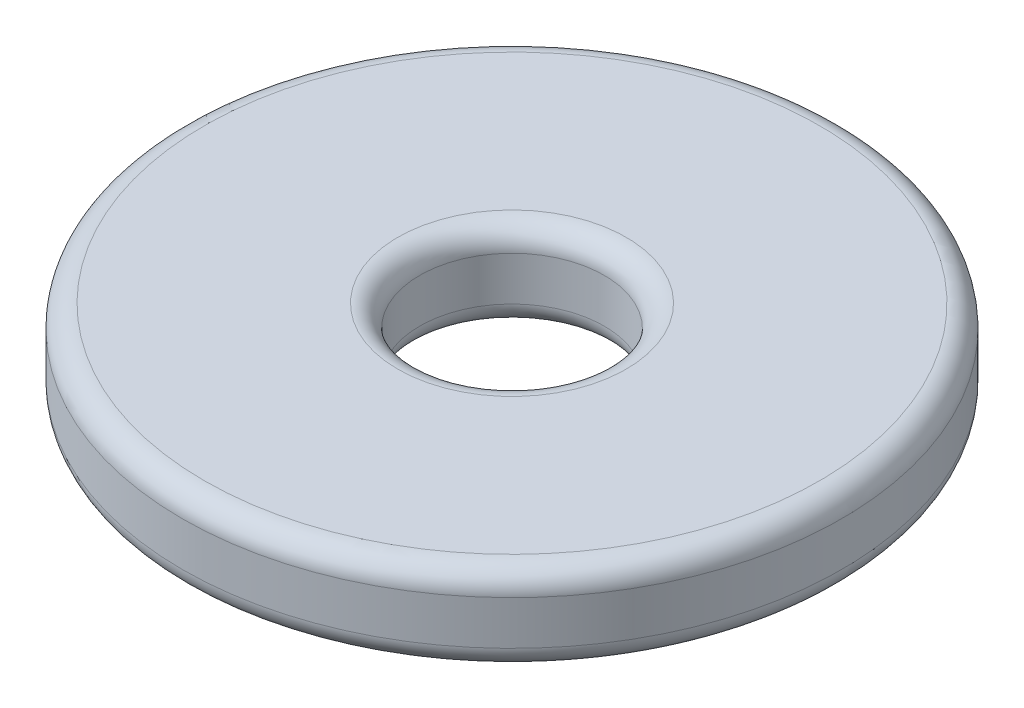
ISO-10303-21;
HEADER;
FILE_DESCRIPTION(('STEP AP214'),'2;1');
FILE_NAME('part.step','',(''),(''),'','','');
FILE_SCHEMA(('AUTOMOTIVE_DESIGN { 1 0 10303 214 1 1 1 1 }'));
ENDSEC;
DATA;
#1=APPLICATION_CONTEXT('core data for automotive mechanical design processes');
#2=APPLICATION_PROTOCOL_DEFINITION('international standard','automotive_design',2000,#1);
#3=PRODUCT_CONTEXT('',#1,'mechanical');
#4=PRODUCT('Part','Part','',(#3));
#5=PRODUCT_RELATED_PRODUCT_CATEGORY('part','',(#4));
#6=PRODUCT_DEFINITION_FORMATION('','',#4);
#7=PRODUCT_DEFINITION_CONTEXT('part definition',#1,'design');
#8=PRODUCT_DEFINITION('design','',#6,#7);
#9=PRODUCT_DEFINITION_SHAPE('','',#8);
#10=(LENGTH_UNIT() NAMED_UNIT(*) SI_UNIT(.MILLI.,.METRE.));
#11=(NAMED_UNIT(*) PLANE_ANGLE_UNIT() SI_UNIT($,.RADIAN.));
#12=(NAMED_UNIT(*) SI_UNIT($,.STERADIAN.) SOLID_ANGLE_UNIT());
#13=UNCERTAINTY_MEASURE_WITH_UNIT(LENGTH_MEASURE(1.E-05),#10,'distance_accuracy_value','');
#14=(GEOMETRIC_REPRESENTATION_CONTEXT(3) GLOBAL_UNCERTAINTY_ASSIGNED_CONTEXT((#13)) GLOBAL_UNIT_ASSIGNED_CONTEXT((#10,
#11,#12)) REPRESENTATION_CONTEXT('',''));
#15=CARTESIAN_POINT('',(0.,0.,0.));
#16=DIRECTION('',(0.,0.,1.));
#17=DIRECTION('',(1.,0.,0.));
#18=AXIS2_PLACEMENT_3D('',#15,#16,#17);
#19=CARTESIAN_POINT('',(0.,2.,0.));
#20=DIRECTION('',(0.,1.,0.));
#21=DIRECTION('',(0.,0.,1.));
#22=AXIS2_PLACEMENT_3D('',#19,#20,#21);
#23=PLANE('',#22);
#24=CARTESIAN_POINT('',(0.,2.,0.));
#25=DIRECTION('',(0.,1.,0.));
#26=DIRECTION('',(0.,0.,1.));
#27=AXIS2_PLACEMENT_3D('',#24,#25,#26);
#28=CIRCLE('',#27,2.6);
#29=CARTESIAN_POINT('',(0.,2.,2.6));
#30=VERTEX_POINT('',#29);
#31=EDGE_CURVE('E42',#30,#30,#28,.F.);
#32=ORIENTED_EDGE('',*,*,#31,.T.);
#33=EDGE_LOOP('',(#32));
#34=FACE_BOUND('',#33,.T.);
#35=CARTESIAN_POINT('',(0.,2.,0.));
#36=DIRECTION('',(0.,1.,0.));
#37=DIRECTION('',(0.,0.,1.));
#38=AXIS2_PLACEMENT_3D('',#35,#36,#37);
#39=CIRCLE('',#38,7.);
#40=CARTESIAN_POINT('',(0.,2.,7.));
#41=VERTEX_POINT('',#40);
#42=EDGE_CURVE('E46',#41,#41,#39,.T.);
#43=ORIENTED_EDGE('',*,*,#42,.T.);
#44=EDGE_LOOP('',(#43));
#45=FACE_BOUND('',#44,.T.);
#46=ADVANCED_FACE('F31',(#34,#45),#23,.T.);
#47=CARTESIAN_POINT('',(0.,0.,0.));
#48=DIRECTION('',(0.,1.,0.));
#49=DIRECTION('',(0.,0.,1.));
#50=AXIS2_PLACEMENT_3D('',#47,#48,#49);
#51=PLANE('',#50);
#52=CARTESIAN_POINT('',(0.,0.,0.));
#53=DIRECTION('',(0.,1.,0.));
#54=DIRECTION('',(0.,0.,1.));
#55=AXIS2_PLACEMENT_3D('',#52,#53,#54);
#56=CIRCLE('',#55,2.6);
#57=CARTESIAN_POINT('',(0.,0.,2.6));
#58=VERTEX_POINT('',#57);
#59=EDGE_CURVE('E57',#58,#58,#56,.T.);
#60=ORIENTED_EDGE('',*,*,#59,.T.);
#61=EDGE_LOOP('',(#60));
#62=FACE_BOUND('',#61,.T.);
#63=CARTESIAN_POINT('',(0.,0.,0.));
#64=DIRECTION('',(0.,1.,0.));
#65=DIRECTION('',(0.,0.,1.));
#66=AXIS2_PLACEMENT_3D('',#63,#64,#65);
#67=CIRCLE('',#66,7.);
#68=CARTESIAN_POINT('',(0.,0.,7.));
#69=VERTEX_POINT('',#68);
#70=EDGE_CURVE('E60',#69,#69,#67,.F.);
#71=ORIENTED_EDGE('',*,*,#70,.T.);
#72=EDGE_LOOP('',(#71));
#73=FACE_BOUND('',#72,.T.);
#74=ADVANCED_FACE('F64',(#62,#73),#51,.F.);
#75=CARTESIAN_POINT('',(0.,2.,0.));
#76=DIRECTION('',(0.,-1.,0.));
#77=DIRECTION('',(0.,0.,-1.));
#78=AXIS2_PLACEMENT_3D('',#75,#76,#77);
#79=CYLINDRICAL_SURFACE('',#78,7.5);
#80=CARTESIAN_POINT('',(0.,0.5,0.));
#81=DIRECTION('',(0.,1.,0.));
#82=DIRECTION('',(0.,0.,1.));
#83=AXIS2_PLACEMENT_3D('',#80,#81,#82);
#84=CIRCLE('',#83,7.5);
#85=CARTESIAN_POINT('',(0.,0.5,7.5));
#86=VERTEX_POINT('',#85);
#87=EDGE_CURVE('E10',#86,#86,#84,.T.);
#88=ORIENTED_EDGE('',*,*,#87,.T.);
#89=EDGE_LOOP('',(#88));
#90=FACE_BOUND('',#89,.T.);
#91=CARTESIAN_POINT('',(0.,1.5,0.));
#92=DIRECTION('',(0.,1.,0.));
#93=DIRECTION('',(0.,0.,1.));
#94=AXIS2_PLACEMENT_3D('',#91,#92,#93);
#95=CIRCLE('',#94,7.5);
#96=CARTESIAN_POINT('',(0.,1.5,7.5));
#97=VERTEX_POINT('',#96);
#98=EDGE_CURVE('E38',#97,#97,#95,.F.);
#99=ORIENTED_EDGE('',*,*,#98,.T.);
#100=EDGE_LOOP('',(#99));
#101=FACE_BOUND('',#100,.T.);
#102=ADVANCED_FACE('F84',(#90,#101),#79,.T.);
#103=CARTESIAN_POINT('',(0.,2.,0.));
#104=DIRECTION('',(0.,-1.,0.));
#105=DIRECTION('',(0.,0.,-1.));
#106=AXIS2_PLACEMENT_3D('',#103,#104,#105);
#107=CYLINDRICAL_SURFACE('',#106,2.1);
#108=CARTESIAN_POINT('',(0.,0.5,0.));
#109=DIRECTION('',(0.,1.,0.));
#110=DIRECTION('',(0.,0.,1.));
#111=AXIS2_PLACEMENT_3D('',#108,#109,#110);
#112=CIRCLE('',#111,2.1);
#113=CARTESIAN_POINT('',(0.,0.5,2.1));
#114=VERTEX_POINT('',#113);
#115=EDGE_CURVE('E51',#114,#114,#112,.F.);
#116=ORIENTED_EDGE('',*,*,#115,.T.);
#117=EDGE_LOOP('',(#116));
#118=FACE_BOUND('',#117,.T.);
#119=CARTESIAN_POINT('',(0.,1.5,0.));
#120=DIRECTION('',(0.,1.,0.));
#121=DIRECTION('',(0.,0.,1.));
#122=AXIS2_PLACEMENT_3D('',#119,#120,#121);
#123=CIRCLE('',#122,2.1);
#124=CARTESIAN_POINT('',(0.,1.5,2.1));
#125=VERTEX_POINT('',#124);
#126=EDGE_CURVE('E54',#125,#125,#123,.T.);
#127=ORIENTED_EDGE('',*,*,#126,.T.);
#128=EDGE_LOOP('',(#127));
#129=FACE_BOUND('',#128,.T.);
#130=ADVANCED_FACE('F89',(#118,#129),#107,.F.);
#131=CARTESIAN_POINT('',(0.,0.5,0.));
#132=DIRECTION('',(0.,1.,0.));
#133=DIRECTION('',(0.,0.,1.));
#134=AXIS2_PLACEMENT_3D('',#131,#132,#133);
#135=TOROIDAL_SURFACE('',#134,2.6,0.5);
#136=ORIENTED_EDGE('',*,*,#115,.F.);
#137=EDGE_LOOP('',(#136));
#138=FACE_BOUND('',#137,.T.);
#139=ORIENTED_EDGE('',*,*,#59,.F.);
#140=EDGE_LOOP('',(#139));
#141=FACE_BOUND('',#140,.T.);
#142=ADVANCED_FACE('F75',(#138,#141),#135,.T.);
#143=CARTESIAN_POINT('',(0.,1.5,0.));
#144=DIRECTION('',(0.,1.,0.));
#145=DIRECTION('',(0.,0.,1.));
#146=AXIS2_PLACEMENT_3D('',#143,#144,#145);
#147=TOROIDAL_SURFACE('',#146,2.6,0.5);
#148=ORIENTED_EDGE('',*,*,#31,.F.);
#149=EDGE_LOOP('',(#148));
#150=FACE_BOUND('',#149,.T.);
#151=ORIENTED_EDGE('',*,*,#126,.F.);
#152=EDGE_LOOP('',(#151));
#153=FACE_BOUND('',#152,.T.);
#154=ADVANCED_FACE('F69',(#150,#153),#147,.T.);
#155=CARTESIAN_POINT('',(0.,0.5,0.));
#156=DIRECTION('',(0.,1.,0.));
#157=DIRECTION('',(0.,0.,1.));
#158=AXIS2_PLACEMENT_3D('',#155,#156,#157);
#159=TOROIDAL_SURFACE('',#158,7.,0.5);
#160=ORIENTED_EDGE('',*,*,#70,.F.);
#161=EDGE_LOOP('',(#160));
#162=FACE_BOUND('',#161,.T.);
#163=ORIENTED_EDGE('',*,*,#87,.F.);
#164=EDGE_LOOP('',(#163));
#165=FACE_BOUND('',#164,.T.);
#166=ADVANCED_FACE('F66',(#162,#165),#159,.T.);
#167=CARTESIAN_POINT('',(0.,1.5,0.));
#168=DIRECTION('',(0.,1.,0.));
#169=DIRECTION('',(0.,0.,1.));
#170=AXIS2_PLACEMENT_3D('',#167,#168,#169);
#171=TOROIDAL_SURFACE('',#170,7.,0.5);
#172=ORIENTED_EDGE('',*,*,#98,.F.);
#173=EDGE_LOOP('',(#172));
#174=FACE_BOUND('',#173,.T.);
#175=ORIENTED_EDGE('',*,*,#42,.F.);
#176=EDGE_LOOP('',(#175));
#177=FACE_BOUND('',#176,.T.);
#178=ADVANCED_FACE('F33',(#174,#177),#171,.T.);
#179=CLOSED_SHELL('',(#46,#74,#102,#130,#142,#154,#166,#178));
#180=MANIFOLD_SOLID_BREP('B2',#179);
#181=ADVANCED_BREP_SHAPE_REPRESENTATION('',(#18,#180),#14);
#182=SHAPE_DEFINITION_REPRESENTATION(#9,#181);
ENDSEC;
END-ISO-10303-21;
